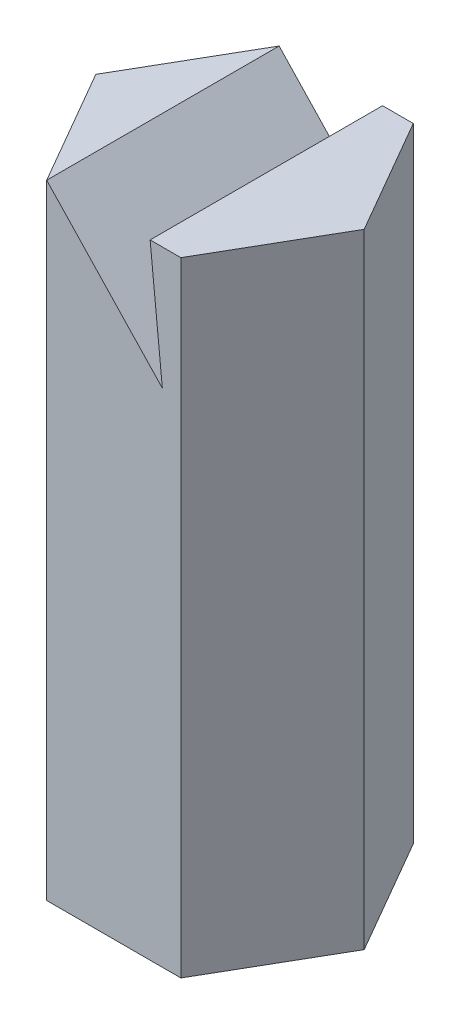
ISO-10303-21;
HEADER;
FILE_DESCRIPTION(('STEP AP214'),'2;1');
FILE_NAME('part.step','',(''),(''),'','','');
FILE_SCHEMA(('AUTOMOTIVE_DESIGN { 1 0 10303 214 1 1 1 1 }'));
ENDSEC;
DATA;
#1=APPLICATION_CONTEXT('core data for automotive mechanical design processes');
#2=APPLICATION_PROTOCOL_DEFINITION('international standard','automotive_design',2000,#1);
#3=PRODUCT_CONTEXT('',#1,'mechanical');
#4=PRODUCT('Part','Part','',(#3));
#5=PRODUCT_RELATED_PRODUCT_CATEGORY('part','',(#4));
#6=PRODUCT_DEFINITION_FORMATION('','',#4);
#7=PRODUCT_DEFINITION_CONTEXT('part definition',#1,'design');
#8=PRODUCT_DEFINITION('design','',#6,#7);
#9=PRODUCT_DEFINITION_SHAPE('','',#8);
#10=(LENGTH_UNIT() NAMED_UNIT(*) SI_UNIT(.MILLI.,.METRE.));
#11=(NAMED_UNIT(*) PLANE_ANGLE_UNIT() SI_UNIT($,.RADIAN.));
#12=(NAMED_UNIT(*) SI_UNIT($,.STERADIAN.) SOLID_ANGLE_UNIT());
#13=UNCERTAINTY_MEASURE_WITH_UNIT(LENGTH_MEASURE(1.E-05),#10,'distance_accuracy_value','');
#14=(GEOMETRIC_REPRESENTATION_CONTEXT(3) GLOBAL_UNCERTAINTY_ASSIGNED_CONTEXT((#13)) GLOBAL_UNIT_ASSIGNED_CONTEXT((#10,
#11,#12)) REPRESENTATION_CONTEXT('',''));
#15=CARTESIAN_POINT('',(0.,0.,0.));
#16=DIRECTION('',(0.,0.,1.));
#17=DIRECTION('',(1.,0.,0.));
#18=AXIS2_PLACEMENT_3D('',#15,#16,#17);
#19=CARTESIAN_POINT('',(-5.48482755730145,51.,9.5));
#20=DIRECTION('',(0.,0.,-1.));
#21=DIRECTION('',(-1.,0.,0.));
#22=AXIS2_PLACEMENT_3D('',#19,#20,#21);
#23=PLANE('',#22);
#24=DIRECTION('',(0.687008973544925,-0.726648931925692,0.));
#25=VECTOR('',#24,1.);
#26=CARTESIAN_POINT('',(-5.48482755730145,51.,9.50000000000001));
#27=LINE('',#26,#25);
#28=CARTESIAN_POINT('',(-5.48482755730145,51.,9.50000000000001));
#29=VERTEX_POINT('',#28);
#30=CARTESIAN_POINT('',(3.96965511460289,41.,9.50000000000001));
#31=VERTEX_POINT('',#30);
#32=EDGE_CURVE('E120',#29,#31,#27,.T.);
#33=ORIENTED_EDGE('',*,*,#32,.F.);
#34=DIRECTION('',(0.,-1.,0.));
#35=VECTOR('',#34,1.);
#36=CARTESIAN_POINT('',(-5.48482755730145,51.,9.5));
#37=LINE('',#36,#35);
#38=CARTESIAN_POINT('',(-5.48482755730145,0.,9.5));
#39=VERTEX_POINT('',#38);
#40=EDGE_CURVE('E11',#29,#39,#37,.T.);
#41=ORIENTED_EDGE('',*,*,#40,.T.);
#42=DIRECTION('',(1.,0.,0.));
#43=VECTOR('',#42,1.);
#44=CARTESIAN_POINT('',(-5.48482755730145,0.,9.5));
#45=LINE('',#44,#43);
#46=CARTESIAN_POINT('',(5.48482755730144,0.,9.50000000000001));
#47=VERTEX_POINT('',#46);
#48=EDGE_CURVE('E140',#39,#47,#45,.T.);
#49=ORIENTED_EDGE('',*,*,#48,.T.);
#50=DIRECTION('',(0.,-1.,0.));
#51=VECTOR('',#50,1.);
#52=CARTESIAN_POINT('',(5.48482755730144,51.,9.50000000000001));
#53=LINE('',#52,#51);
#54=CARTESIAN_POINT('',(5.48482755730144,51.,9.50000000000001));
#55=VERTEX_POINT('',#54);
#56=EDGE_CURVE('E50',#55,#47,#53,.T.);
#57=ORIENTED_EDGE('',*,*,#56,.F.);
#58=DIRECTION('',(1.,0.,0.));
#59=VECTOR('',#58,1.);
#60=CARTESIAN_POINT('',(-5.48482755730145,51.,9.5));
#61=LINE('',#60,#59);
#62=CARTESIAN_POINT('',(2.96965511460289,51.,9.5));
#63=VERTEX_POINT('',#62);
#64=EDGE_CURVE('E98',#63,#55,#61,.T.);
#65=ORIENTED_EDGE('',*,*,#64,.F.);
#66=DIRECTION('',(-0.0995037190209989,0.995037190209989,0.));
#67=VECTOR('',#66,1.);
#68=CARTESIAN_POINT('',(3.96965511460289,41.,9.50000000000001));
#69=LINE('',#68,#67);
#70=EDGE_CURVE('E53',#31,#63,#69,.T.);
#71=ORIENTED_EDGE('',*,*,#70,.F.);
#72=EDGE_LOOP('',(#33,#41,#49,#57,#65,#71));
#73=FACE_BOUND('',#72,.T.);
#74=ADVANCED_FACE('F39',(#73),#23,.F.);
#75=CARTESIAN_POINT('',(0.,51.,0.));
#76=DIRECTION('',(0.,1.,0.));
#77=DIRECTION('',(0.,0.,1.));
#78=AXIS2_PLACEMENT_3D('',#75,#76,#77);
#79=PLANE('',#78);
#80=DIRECTION('',(-1.,0.,0.));
#81=VECTOR('',#80,1.);
#82=CARTESIAN_POINT('',(5.48482755730145,51.,-9.5));
#83=LINE('',#82,#81);
#84=CARTESIAN_POINT('',(5.48482755730145,51.,-9.5));
#85=VERTEX_POINT('',#84);
#86=CARTESIAN_POINT('',(2.96965511460289,51.,-9.50000000000001));
#87=VERTEX_POINT('',#86);
#88=EDGE_CURVE('E177',#85,#87,#83,.T.);
#89=ORIENTED_EDGE('',*,*,#88,.T.);
#90=DIRECTION('',(0.,0.,1.));
#91=VECTOR('',#90,1.);
#92=CARTESIAN_POINT('',(2.96965511460289,51.,-9.50000000000001));
#93=LINE('',#92,#91);
#94=EDGE_CURVE('E138',#87,#63,#93,.T.);
#95=ORIENTED_EDGE('',*,*,#94,.T.);
#96=ORIENTED_EDGE('',*,*,#64,.T.);
#97=DIRECTION('',(0.5,0.,-0.866025403784438));
#98=VECTOR('',#97,1.);
#99=CARTESIAN_POINT('',(5.48482755730144,51.,9.50000000000001));
#100=LINE('',#99,#98);
#101=CARTESIAN_POINT('',(10.9696551146029,51.,0.));
#102=VERTEX_POINT('',#101);
#103=EDGE_CURVE('E167',#55,#102,#100,.T.);
#104=ORIENTED_EDGE('',*,*,#103,.T.);
#105=DIRECTION('',(-0.5,0.,-0.866025403784439));
#106=VECTOR('',#105,1.);
#107=CARTESIAN_POINT('',(10.9696551146029,51.,0.));
#108=LINE('',#107,#106);
#109=EDGE_CURVE('E182',#102,#85,#108,.T.);
#110=ORIENTED_EDGE('',*,*,#109,.T.);
#111=EDGE_LOOP('',(#89,#95,#96,#104,#110));
#112=FACE_BOUND('',#111,.T.);
#113=ADVANCED_FACE('F197',(#112),#79,.T.);
#114=CARTESIAN_POINT('',(-10.9696551146029,51.,0.));
#115=DIRECTION('',(0.866025403784439,0.,-0.499999999999999));
#116=DIRECTION('',(-0.499999999999999,0.,-0.866025403784439));
#117=AXIS2_PLACEMENT_3D('',#114,#115,#116);
#118=PLANE('',#117);
#119=DIRECTION('',(0.499999999999999,0.,0.866025403784439));
#120=VECTOR('',#119,1.);
#121=CARTESIAN_POINT('',(-10.9696551146029,0.,0.));
#122=LINE('',#121,#120);
#123=CARTESIAN_POINT('',(-10.9696551146029,0.,0.));
#124=VERTEX_POINT('',#123);
#125=EDGE_CURVE('E131',#124,#39,#122,.T.);
#126=ORIENTED_EDGE('',*,*,#125,.T.);
#127=ORIENTED_EDGE('',*,*,#40,.F.);
#128=DIRECTION('',(0.499999999999999,0.,0.866025403784439));
#129=VECTOR('',#128,1.);
#130=CARTESIAN_POINT('',(-10.9696551146029,51.,0.));
#131=LINE('',#130,#129);
#132=CARTESIAN_POINT('',(-10.9696551146029,51.,0.));
#133=VERTEX_POINT('',#132);
#134=EDGE_CURVE('E129',#133,#29,#131,.T.);
#135=ORIENTED_EDGE('',*,*,#134,.F.);
#136=DIRECTION('',(0.,-1.,0.));
#137=VECTOR('',#136,1.);
#138=CARTESIAN_POINT('',(-10.9696551146029,51.,0.));
#139=LINE('',#138,#137);
#140=EDGE_CURVE('E133',#133,#124,#139,.T.);
#141=ORIENTED_EDGE('',*,*,#140,.T.);
#142=EDGE_LOOP('',(#126,#127,#135,#141));
#143=FACE_BOUND('',#142,.T.);
#144=ADVANCED_FACE('F41',(#143),#118,.F.);
#145=CARTESIAN_POINT('',(5.48482755730144,51.,9.50000000000001));
#146=DIRECTION('',(-0.866025403784438,0.,-0.5));
#147=DIRECTION('',(-0.5,0.,0.866025403784438));
#148=AXIS2_PLACEMENT_3D('',#145,#146,#147);
#149=PLANE('',#148);
#150=DIRECTION('',(0.5,0.,-0.866025403784438));
#151=VECTOR('',#150,1.);
#152=CARTESIAN_POINT('',(5.48482755730144,0.,9.50000000000001));
#153=LINE('',#152,#151);
#154=CARTESIAN_POINT('',(10.9696551146029,0.,0.));
#155=VERTEX_POINT('',#154);
#156=EDGE_CURVE('E139',#47,#155,#153,.T.);
#157=ORIENTED_EDGE('',*,*,#156,.T.);
#158=DIRECTION('',(0.,-1.,0.));
#159=VECTOR('',#158,1.);
#160=CARTESIAN_POINT('',(10.9696551146029,51.,0.));
#161=LINE('',#160,#159);
#162=EDGE_CURVE('E158',#102,#155,#161,.T.);
#163=ORIENTED_EDGE('',*,*,#162,.F.);
#164=ORIENTED_EDGE('',*,*,#103,.F.);
#165=ORIENTED_EDGE('',*,*,#56,.T.);
#166=EDGE_LOOP('',(#157,#163,#164,#165));
#167=FACE_BOUND('',#166,.T.);
#168=ADVANCED_FACE('F163',(#167),#149,.F.);
#169=CARTESIAN_POINT('',(10.9696551146029,51.,0.));
#170=DIRECTION('',(-0.866025403784439,0.,0.5));
#171=DIRECTION('',(0.5,0.,0.866025403784439));
#172=AXIS2_PLACEMENT_3D('',#169,#170,#171);
#173=PLANE('',#172);
#174=DIRECTION('',(-0.5,0.,-0.866025403784439));
#175=VECTOR('',#174,1.);
#176=CARTESIAN_POINT('',(10.9696551146029,0.,0.));
#177=LINE('',#176,#175);
#178=CARTESIAN_POINT('',(5.48482755730145,0.,-9.5));
#179=VERTEX_POINT('',#178);
#180=EDGE_CURVE('E150',#155,#179,#177,.T.);
#181=ORIENTED_EDGE('',*,*,#180,.T.);
#182=DIRECTION('',(0.,-1.,0.));
#183=VECTOR('',#182,1.);
#184=CARTESIAN_POINT('',(5.48482755730145,51.,-9.5));
#185=LINE('',#184,#183);
#186=EDGE_CURVE('E154',#85,#179,#185,.T.);
#187=ORIENTED_EDGE('',*,*,#186,.F.);
#188=ORIENTED_EDGE('',*,*,#109,.F.);
#189=ORIENTED_EDGE('',*,*,#162,.T.);
#190=EDGE_LOOP('',(#181,#187,#188,#189));
#191=FACE_BOUND('',#190,.T.);
#192=ADVANCED_FACE('F175',(#191),#173,.F.);
#193=CARTESIAN_POINT('',(5.48482755730145,51.,-9.5));
#194=DIRECTION('',(0.,0.,1.));
#195=DIRECTION('',(1.,0.,0.));
#196=AXIS2_PLACEMENT_3D('',#193,#194,#195);
#197=PLANE('',#196);
#198=DIRECTION('',(0.687008973544925,-0.726648931925692,0.));
#199=VECTOR('',#198,1.);
#200=CARTESIAN_POINT('',(-5.48482755730145,51.,-9.50000000000001));
#201=LINE('',#200,#199);
#202=CARTESIAN_POINT('',(-5.48482755730145,51.,-9.50000000000001));
#203=VERTEX_POINT('',#202);
#204=CARTESIAN_POINT('',(3.96965511460289,41.,-9.50000000000001));
#205=VERTEX_POINT('',#204);
#206=EDGE_CURVE('E116',#203,#205,#201,.T.);
#207=ORIENTED_EDGE('',*,*,#206,.T.);
#208=DIRECTION('',(-0.0995037190209989,0.995037190209989,0.));
#209=VECTOR('',#208,1.);
#210=CARTESIAN_POINT('',(3.96965511460289,41.,-9.50000000000001));
#211=LINE('',#210,#209);
#212=EDGE_CURVE('E125',#205,#87,#211,.T.);
#213=ORIENTED_EDGE('',*,*,#212,.T.);
#214=ORIENTED_EDGE('',*,*,#88,.F.);
#215=ORIENTED_EDGE('',*,*,#186,.T.);
#216=DIRECTION('',(-1.,0.,0.));
#217=VECTOR('',#216,1.);
#218=CARTESIAN_POINT('',(5.48482755730145,0.,-9.5));
#219=LINE('',#218,#217);
#220=CARTESIAN_POINT('',(-5.48482755730144,0.,-9.50000000000001));
#221=VERTEX_POINT('',#220);
#222=EDGE_CURVE('E149',#179,#221,#219,.T.);
#223=ORIENTED_EDGE('',*,*,#222,.T.);
#224=DIRECTION('',(0.,-1.,0.));
#225=VECTOR('',#224,1.);
#226=CARTESIAN_POINT('',(-5.48482755730144,51.,-9.50000000000001));
#227=LINE('',#226,#225);
#228=EDGE_CURVE('E153',#203,#221,#227,.T.);
#229=ORIENTED_EDGE('',*,*,#228,.F.);
#230=EDGE_LOOP('',(#207,#213,#214,#215,#223,#229));
#231=FACE_BOUND('',#230,.T.);
#232=ADVANCED_FACE('F176',(#231),#197,.F.);
#233=CARTESIAN_POINT('',(-5.48482755730144,51.,-9.50000000000001));
#234=DIRECTION('',(0.866025403784438,0.,0.5));
#235=DIRECTION('',(0.5,0.,-0.866025403784438));
#236=AXIS2_PLACEMENT_3D('',#233,#234,#235);
#237=PLANE('',#236);
#238=DIRECTION('',(-0.5,0.,0.866025403784438));
#239=VECTOR('',#238,1.);
#240=CARTESIAN_POINT('',(-5.48482755730144,0.,-9.50000000000001));
#241=LINE('',#240,#239);
#242=EDGE_CURVE('E93',#221,#124,#241,.T.);
#243=ORIENTED_EDGE('',*,*,#242,.T.);
#244=ORIENTED_EDGE('',*,*,#140,.F.);
#245=DIRECTION('',(-0.5,0.,0.866025403784438));
#246=VECTOR('',#245,1.);
#247=CARTESIAN_POINT('',(-5.48482755730144,51.,-9.50000000000001));
#248=LINE('',#247,#246);
#249=EDGE_CURVE('E64',#203,#133,#248,.T.);
#250=ORIENTED_EDGE('',*,*,#249,.F.);
#251=ORIENTED_EDGE('',*,*,#228,.T.);
#252=EDGE_LOOP('',(#243,#244,#250,#251));
#253=FACE_BOUND('',#252,.T.);
#254=ADVANCED_FACE('F186',(#253),#237,.F.);
#255=DIRECTION('',(0.,0.,1.));
#256=VECTOR('',#255,1.);
#257=CARTESIAN_POINT('',(-5.48482755730145,51.,-9.50000000000001));
#258=LINE('',#257,#256);
#259=EDGE_CURVE('E111',#203,#29,#258,.T.);
#260=ORIENTED_EDGE('',*,*,#259,.F.);
#261=ORIENTED_EDGE('',*,*,#249,.T.);
#262=ORIENTED_EDGE('',*,*,#134,.T.);
#263=EDGE_LOOP('',(#260,#261,#262));
#264=FACE_BOUND('',#263,.T.);
#265=ADVANCED_FACE('F128',(#264),#79,.T.);
#266=CARTESIAN_POINT('',(0.,0.,0.));
#267=DIRECTION('',(0.,1.,0.));
#268=DIRECTION('',(0.,0.,1.));
#269=AXIS2_PLACEMENT_3D('',#266,#267,#268);
#270=PLANE('',#269);
#271=ORIENTED_EDGE('',*,*,#125,.F.);
#272=ORIENTED_EDGE('',*,*,#242,.F.);
#273=ORIENTED_EDGE('',*,*,#222,.F.);
#274=ORIENTED_EDGE('',*,*,#180,.F.);
#275=ORIENTED_EDGE('',*,*,#156,.F.);
#276=ORIENTED_EDGE('',*,*,#48,.F.);
#277=EDGE_LOOP('',(#271,#272,#273,#274,#275,#276));
#278=FACE_BOUND('',#277,.T.);
#279=ADVANCED_FACE('F169',(#278),#270,.F.);
#280=CARTESIAN_POINT('',(3.96965511460289,41.,-9.50000000000001));
#281=DIRECTION('',(0.995037190209989,0.0995037190209989,0.));
#282=DIRECTION('',(-0.0995037190209989,0.995037190209989,0.));
#283=AXIS2_PLACEMENT_3D('',#280,#281,#282);
#284=PLANE('',#283);
#285=ORIENTED_EDGE('',*,*,#94,.F.);
#286=ORIENTED_EDGE('',*,*,#212,.F.);
#287=DIRECTION('',(0.,0.,1.));
#288=VECTOR('',#287,1.);
#289=CARTESIAN_POINT('',(3.96965511460289,41.,-9.50000000000001));
#290=LINE('',#289,#288);
#291=EDGE_CURVE('E121',#205,#31,#290,.T.);
#292=ORIENTED_EDGE('',*,*,#291,.T.);
#293=ORIENTED_EDGE('',*,*,#70,.T.);
#294=EDGE_LOOP('',(#285,#286,#292,#293));
#295=FACE_BOUND('',#294,.T.);
#296=ADVANCED_FACE('F218',(#295),#284,.F.);
#297=CARTESIAN_POINT('',(-5.48482755730145,51.,-9.50000000000001));
#298=DIRECTION('',(-0.726648931925692,-0.687008973544925,0.));
#299=DIRECTION('',(0.687008973544925,-0.726648931925692,0.));
#300=AXIS2_PLACEMENT_3D('',#297,#298,#299);
#301=PLANE('',#300);
#302=ORIENTED_EDGE('',*,*,#291,.F.);
#303=ORIENTED_EDGE('',*,*,#206,.F.);
#304=ORIENTED_EDGE('',*,*,#259,.T.);
#305=ORIENTED_EDGE('',*,*,#32,.T.);
#306=EDGE_LOOP('',(#302,#303,#304,#305));
#307=FACE_BOUND('',#306,.T.);
#308=ADVANCED_FACE('F117',(#307),#301,.F.);
#309=CLOSED_SHELL('',(#74,#113,#144,#168,#192,#232,#254,#265,#279,#296,#308));
#310=MANIFOLD_SOLID_BREP('B2',#309);
#311=ADVANCED_BREP_SHAPE_REPRESENTATION('',(#18,#310),#14);
#312=SHAPE_DEFINITION_REPRESENTATION(#9,#311);
ENDSEC;
END-ISO-10303-21;
